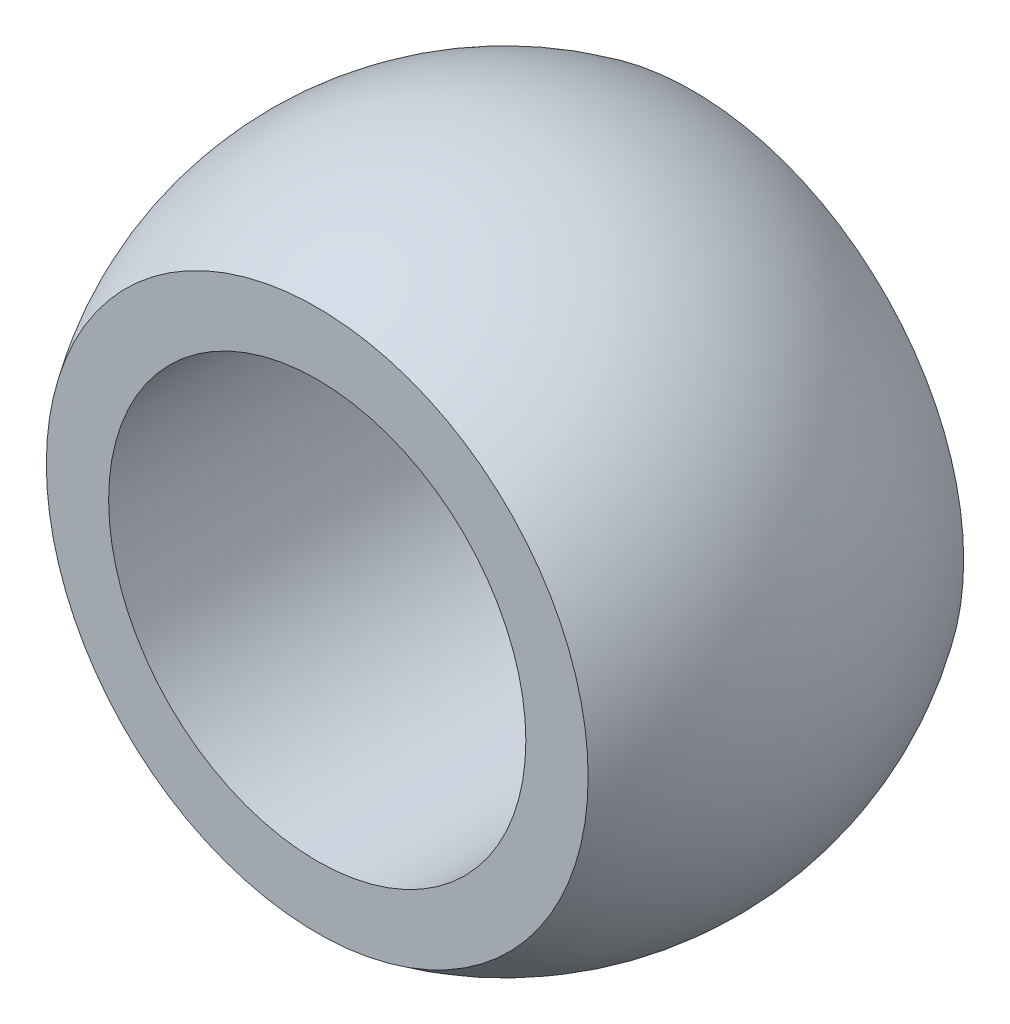
ISO-10303-21;
HEADER;
FILE_DESCRIPTION(('STEP AP214'),'2;1');
FILE_NAME('part.step','',(''),(''),'','','');
FILE_SCHEMA(('AUTOMOTIVE_DESIGN { 1 0 10303 214 1 1 1 1 }'));
ENDSEC;
DATA;
#1=APPLICATION_CONTEXT('core data for automotive mechanical design processes');
#2=APPLICATION_PROTOCOL_DEFINITION('international standard','automotive_design',2000,#1);
#3=PRODUCT_CONTEXT('',#1,'mechanical');
#4=PRODUCT('Part','Part','',(#3));
#5=PRODUCT_RELATED_PRODUCT_CATEGORY('part','',(#4));
#6=PRODUCT_DEFINITION_FORMATION('','',#4);
#7=PRODUCT_DEFINITION_CONTEXT('part definition',#1,'design');
#8=PRODUCT_DEFINITION('design','',#6,#7);
#9=PRODUCT_DEFINITION_SHAPE('','',#8);
#10=(LENGTH_UNIT() NAMED_UNIT(*) SI_UNIT(.MILLI.,.METRE.));
#11=(NAMED_UNIT(*) PLANE_ANGLE_UNIT() SI_UNIT($,.RADIAN.));
#12=(NAMED_UNIT(*) SI_UNIT($,.STERADIAN.) SOLID_ANGLE_UNIT());
#13=UNCERTAINTY_MEASURE_WITH_UNIT(LENGTH_MEASURE(1.E-05),#10,'distance_accuracy_value','');
#14=(GEOMETRIC_REPRESENTATION_CONTEXT(3) GLOBAL_UNCERTAINTY_ASSIGNED_CONTEXT((#13)) GLOBAL_UNIT_ASSIGNED_CONTEXT((#10,
#11,#12)) REPRESENTATION_CONTEXT('',''));
#15=CARTESIAN_POINT('',(0.,0.,0.));
#16=DIRECTION('',(0.,0.,1.));
#17=DIRECTION('',(1.,0.,0.));
#18=AXIS2_PLACEMENT_3D('',#15,#16,#17);
#19=CARTESIAN_POINT('',(0.,0.,0.));
#20=DIRECTION('',(-1.,0.,0.));
#21=DIRECTION('',(0.,0.,-1.));
#22=AXIS2_PLACEMENT_3D('',#19,#20,#21);
#23=SPHERICAL_SURFACE('',#22,7.9);
#24=CARTESIAN_POINT('',(0.,0.,0.));
#25=DIRECTION('',(0.,0.,-1.));
#26=DIRECTION('',(-1.,0.,0.));
#27=AXIS2_PLACEMENT_3D('',#24,#25,#26);
#28=SPHERICAL_SURFACE('',#27,7.9);
#29=CARTESIAN_POINT('',(0.,0.,4.5));
#30=DIRECTION('',(0.,0.,-1.));
#31=DIRECTION('',(-1.,0.,0.));
#32=AXIS2_PLACEMENT_3D('',#29,#30,#31);
#33=CIRCLE('',#32,6.49307323229917);
#34=CARTESIAN_POINT('',(-6.49307323229917,0.,4.5));
#35=VERTEX_POINT('',#34);
#36=EDGE_CURVE('E11',#35,#35,#33,.T.);
#37=ORIENTED_EDGE('',*,*,#36,.T.);
#38=EDGE_LOOP('',(#37));
#39=FACE_BOUND('',#38,.T.);
#40=CARTESIAN_POINT('',(0.,0.,-4.5));
#41=DIRECTION('',(0.,0.,1.));
#42=DIRECTION('',(1.,0.,0.));
#43=AXIS2_PLACEMENT_3D('',#40,#41,#42);
#44=CIRCLE('',#43,6.49307323229917);
#45=CARTESIAN_POINT('',(6.49307323229917,0.,-4.5));
#46=VERTEX_POINT('',#45);
#47=EDGE_CURVE('E54',#46,#46,#44,.T.);
#48=ORIENTED_EDGE('',*,*,#47,.T.);
#49=EDGE_LOOP('',(#48));
#50=FACE_BOUND('',#49,.T.);
#51=ADVANCED_FACE('F46',(#39,#50),#28,.T.);
#52=CARTESIAN_POINT('',(-11.0368375198868,10.,-4.5));
#53=DIRECTION('',(0.,0.,1.));
#54=DIRECTION('',(1.,0.,0.));
#55=AXIS2_PLACEMENT_3D('',#52,#53,#54);
#56=PLANE('',#55);
#57=CARTESIAN_POINT('',(0.,0.,-4.5));
#58=DIRECTION('',(0.,0.,-1.));
#59=DIRECTION('',(-1.,0.,0.));
#60=AXIS2_PLACEMENT_3D('',#57,#58,#59);
#61=CIRCLE('',#60,5.);
#62=CARTESIAN_POINT('',(-5.,0.,-4.5));
#63=VERTEX_POINT('',#62);
#64=EDGE_CURVE('E61',#63,#63,#61,.T.);
#65=ORIENTED_EDGE('',*,*,#64,.F.);
#66=EDGE_LOOP('',(#65));
#67=FACE_BOUND('',#66,.T.);
#68=ORIENTED_EDGE('',*,*,#47,.F.);
#69=EDGE_LOOP('',(#68));
#70=FACE_BOUND('',#69,.T.);
#71=ADVANCED_FACE('F79',(#67,#70),#56,.F.);
#72=CARTESIAN_POINT('',(-11.0368375198868,10.,4.5));
#73=DIRECTION('',(0.,0.,-1.));
#74=DIRECTION('',(-1.,0.,0.));
#75=AXIS2_PLACEMENT_3D('',#72,#73,#74);
#76=PLANE('',#75);
#77=CARTESIAN_POINT('',(0.,0.,4.5));
#78=DIRECTION('',(0.,0.,-1.));
#79=DIRECTION('',(-1.,0.,0.));
#80=AXIS2_PLACEMENT_3D('',#77,#78,#79);
#81=CIRCLE('',#80,5.);
#82=CARTESIAN_POINT('',(-5.,0.,4.5));
#83=VERTEX_POINT('',#82);
#84=EDGE_CURVE('E49',#83,#83,#81,.T.);
#85=ORIENTED_EDGE('',*,*,#84,.T.);
#86=EDGE_LOOP('',(#85));
#87=FACE_BOUND('',#86,.T.);
#88=ORIENTED_EDGE('',*,*,#36,.F.);
#89=EDGE_LOOP('',(#88));
#90=FACE_BOUND('',#89,.T.);
#91=ADVANCED_FACE('F70',(#87,#90),#76,.F.);
#92=CARTESIAN_POINT('',(0.,0.,5.5));
#93=DIRECTION('',(0.,0.,-1.));
#94=DIRECTION('',(-1.,0.,0.));
#95=AXIS2_PLACEMENT_3D('',#92,#93,#94);
#96=CYLINDRICAL_SURFACE('',#95,5.);
#97=ORIENTED_EDGE('',*,*,#64,.T.);
#98=EDGE_LOOP('',(#97));
#99=FACE_BOUND('',#98,.T.);
#100=ORIENTED_EDGE('',*,*,#84,.F.);
#101=EDGE_LOOP('',(#100));
#102=FACE_BOUND('',#101,.T.);
#103=ADVANCED_FACE('F73',(#99,#102),#96,.F.);
#104=CLOSED_SHELL('',(#51,#71,#91,#103));
#105=MANIFOLD_SOLID_BREP('B2',#104);
#106=ADVANCED_BREP_SHAPE_REPRESENTATION('',(#18,#105),#14);
#107=SHAPE_DEFINITION_REPRESENTATION(#9,#106);
ENDSEC;
END-ISO-10303-21;
